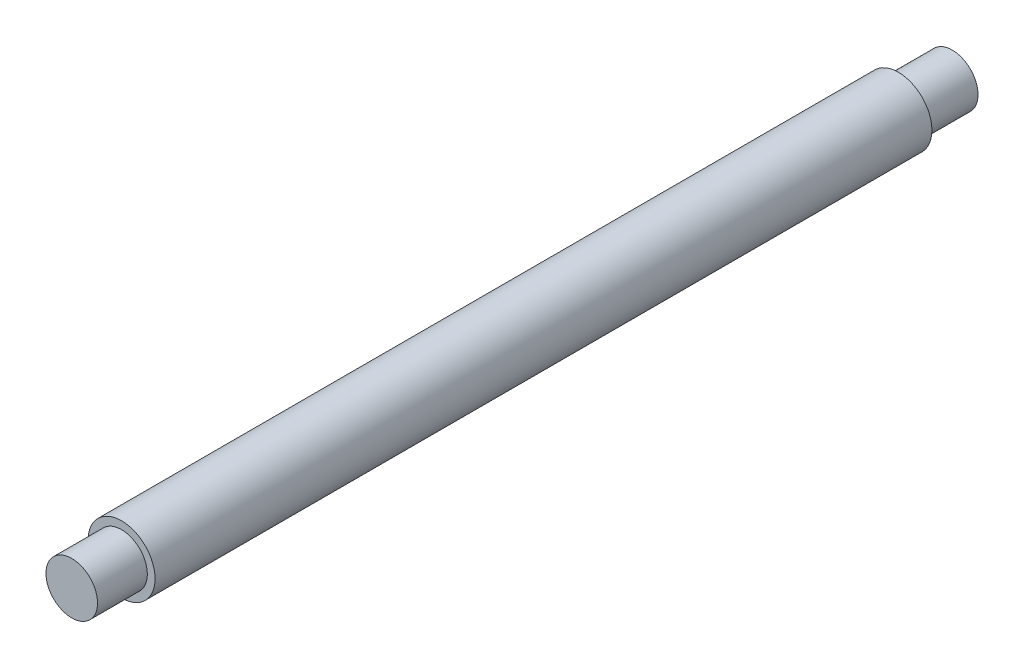
ISO-10303-21;
HEADER;
FILE_DESCRIPTION(('STEP AP214'),'2;1');
FILE_NAME('part.step','',(''),(''),'','','');
FILE_SCHEMA(('AUTOMOTIVE_DESIGN { 1 0 10303 214 1 1 1 1 }'));
ENDSEC;
DATA;
#1=APPLICATION_CONTEXT('core data for automotive mechanical design processes');
#2=APPLICATION_PROTOCOL_DEFINITION('international standard','automotive_design',2000,#1);
#3=PRODUCT_CONTEXT('',#1,'mechanical');
#4=PRODUCT('Part','Part','',(#3));
#5=PRODUCT_RELATED_PRODUCT_CATEGORY('part','',(#4));
#6=PRODUCT_DEFINITION_FORMATION('','',#4);
#7=PRODUCT_DEFINITION_CONTEXT('part definition',#1,'design');
#8=PRODUCT_DEFINITION('design','',#6,#7);
#9=PRODUCT_DEFINITION_SHAPE('','',#8);
#10=(LENGTH_UNIT() NAMED_UNIT(*) SI_UNIT(.MILLI.,.METRE.));
#11=(NAMED_UNIT(*) PLANE_ANGLE_UNIT() SI_UNIT($,.RADIAN.));
#12=(NAMED_UNIT(*) SI_UNIT($,.STERADIAN.) SOLID_ANGLE_UNIT());
#13=UNCERTAINTY_MEASURE_WITH_UNIT(LENGTH_MEASURE(1.E-05),#10,'distance_accuracy_value','');
#14=(GEOMETRIC_REPRESENTATION_CONTEXT(3) GLOBAL_UNCERTAINTY_ASSIGNED_CONTEXT((#13)) GLOBAL_UNIT_ASSIGNED_CONTEXT((#10,
#11,#12)) REPRESENTATION_CONTEXT('',''));
#15=CARTESIAN_POINT('',(0.,0.,0.));
#16=DIRECTION('',(0.,0.,1.));
#17=DIRECTION('',(1.,0.,0.));
#18=AXIS2_PLACEMENT_3D('',#15,#16,#17);
#19=CARTESIAN_POINT('',(0.,0.,3.72));
#20=DIRECTION('',(0.,0.,-1.));
#21=DIRECTION('',(-1.,0.,0.));
#22=AXIS2_PLACEMENT_3D('',#19,#20,#21);
#23=CYLINDRICAL_SURFACE('',#22,1.925);
#24=CARTESIAN_POINT('',(0.,0.,3.72));
#25=DIRECTION('',(0.,0.,1.));
#26=DIRECTION('',(1.,0.,0.));
#27=AXIS2_PLACEMENT_3D('',#24,#25,#26);
#28=CIRCLE('',#27,1.925);
#29=CARTESIAN_POINT('',(1.925,0.,3.72));
#30=VERTEX_POINT('',#29);
#31=EDGE_CURVE('E48',#30,#30,#28,.T.);
#32=ORIENTED_EDGE('',*,*,#31,.F.);
#33=EDGE_LOOP('',(#32));
#34=FACE_BOUND('',#33,.T.);
#35=CARTESIAN_POINT('',(0.,0.,0.));
#36=DIRECTION('',(0.,0.,1.));
#37=DIRECTION('',(1.,0.,0.));
#38=AXIS2_PLACEMENT_3D('',#35,#36,#37);
#39=CIRCLE('',#38,1.925);
#40=CARTESIAN_POINT('',(1.925,0.,0.));
#41=VERTEX_POINT('',#40);
#42=EDGE_CURVE('E44',#41,#41,#39,.T.);
#43=ORIENTED_EDGE('',*,*,#42,.T.);
#44=EDGE_LOOP('',(#43));
#45=FACE_BOUND('',#44,.T.);
#46=ADVANCED_FACE('F41',(#34,#45),#23,.T.);
#47=CARTESIAN_POINT('',(0.,0.,3.72));
#48=DIRECTION('',(0.,0.,1.));
#49=DIRECTION('',(1.,0.,0.));
#50=AXIS2_PLACEMENT_3D('',#47,#48,#49);
#51=PLANE('',#50);
#52=ORIENTED_EDGE('',*,*,#31,.T.);
#53=EDGE_LOOP('',(#52));
#54=FACE_BOUND('',#53,.T.);
#55=ADVANCED_FACE('F83',(#54),#51,.T.);
#56=CARTESIAN_POINT('',(0.,0.,-58.));
#57=DIRECTION('',(0.,0.,1.));
#58=DIRECTION('',(1.,0.,0.));
#59=AXIS2_PLACEMENT_3D('',#56,#57,#58);
#60=CYLINDRICAL_SURFACE('',#59,2.5);
#61=CARTESIAN_POINT('',(0.,0.,-58.));
#62=DIRECTION('',(0.,0.,-1.));
#63=DIRECTION('',(-1.,0.,0.));
#64=AXIS2_PLACEMENT_3D('',#61,#62,#63);
#65=CIRCLE('',#64,2.5);
#66=CARTESIAN_POINT('',(2.5,0.,-58.));
#67=VERTEX_POINT('',#66);
#68=EDGE_CURVE('E56',#67,#67,#65,.T.);
#69=CARTESIAN_POINT('',(0.,0.,0.));
#70=DIRECTION('',(0.,0.,-1.));
#71=DIRECTION('',(-1.,0.,0.));
#72=AXIS2_PLACEMENT_3D('',#69,#70,#71);
#73=CIRCLE('',#72,2.5);
#74=CARTESIAN_POINT('',(2.5,0.,0.));
#75=VERTEX_POINT('',#74);
#76=EDGE_CURVE('E59',#75,#75,#73,.T.);
#77=CARTESIAN_POINT('',(2.5,0.,-58.));
#78=CARTESIAN_POINT('',(2.5,0.,-57.3958333333333));
#79=CARTESIAN_POINT('',(2.5,0.,-56.7916666666667));
#80=CARTESIAN_POINT('',(2.5,0.,-55.5833333333333));
#81=CARTESIAN_POINT('',(2.5,0.,-54.9791666666667));
#82=CARTESIAN_POINT('',(2.5,0.,-53.7708333333333));
#83=CARTESIAN_POINT('',(2.5,0.,-53.1666666666667));
#84=CARTESIAN_POINT('',(2.5,0.,-51.9583333333333));
#85=CARTESIAN_POINT('',(2.5,0.,-51.3541666666667));
#86=CARTESIAN_POINT('',(2.5,0.,-50.1458333333333));
#87=CARTESIAN_POINT('',(2.5,0.,-49.5416666666667));
#88=CARTESIAN_POINT('',(2.5,0.,-48.3333333333333));
#89=CARTESIAN_POINT('',(2.5,0.,-47.7291666666667));
#90=CARTESIAN_POINT('',(2.5,0.,-46.5208333333333));
#91=CARTESIAN_POINT('',(2.5,0.,-45.9166666666667));
#92=CARTESIAN_POINT('',(2.5,0.,-44.7083333333333));
#93=CARTESIAN_POINT('',(2.5,0.,-44.1041666666667));
#94=CARTESIAN_POINT('',(2.5,0.,-42.8958333333333));
#95=CARTESIAN_POINT('',(2.5,0.,-42.2916666666667));
#96=CARTESIAN_POINT('',(2.5,0.,-41.0833333333333));
#97=CARTESIAN_POINT('',(2.5,0.,-40.4791666666667));
#98=CARTESIAN_POINT('',(2.5,0.,-39.2708333333333));
#99=CARTESIAN_POINT('',(2.5,0.,-38.6666666666667));
#100=CARTESIAN_POINT('',(2.5,0.,-37.4583333333333));
#101=CARTESIAN_POINT('',(2.5,0.,-36.8541666666667));
#102=CARTESIAN_POINT('',(2.5,0.,-35.6458333333333));
#103=CARTESIAN_POINT('',(2.5,0.,-35.0416666666667));
#104=CARTESIAN_POINT('',(2.5,0.,-33.8333333333333));
#105=CARTESIAN_POINT('',(2.5,0.,-33.2291666666667));
#106=CARTESIAN_POINT('',(2.5,0.,-32.0208333333333));
#107=CARTESIAN_POINT('',(2.5,0.,-31.4166666666667));
#108=CARTESIAN_POINT('',(2.5,0.,-30.2083333333333));
#109=CARTESIAN_POINT('',(2.5,0.,-29.6041666666667));
#110=CARTESIAN_POINT('',(2.5,0.,-28.3958333333333));
#111=CARTESIAN_POINT('',(2.5,0.,-27.7916666666667));
#112=CARTESIAN_POINT('',(2.5,0.,-26.5833333333333));
#113=CARTESIAN_POINT('',(2.5,0.,-25.9791666666667));
#114=CARTESIAN_POINT('',(2.5,0.,-24.7708333333333));
#115=CARTESIAN_POINT('',(2.5,0.,-24.1666666666667));
#116=CARTESIAN_POINT('',(2.5,0.,-22.9583333333333));
#117=CARTESIAN_POINT('',(2.5,0.,-22.3541666666667));
#118=CARTESIAN_POINT('',(2.5,0.,-21.1458333333333));
#119=CARTESIAN_POINT('',(2.5,0.,-20.5416666666667));
#120=CARTESIAN_POINT('',(2.5,0.,-19.3333333333333));
#121=CARTESIAN_POINT('',(2.5,0.,-18.7291666666667));
#122=CARTESIAN_POINT('',(2.5,0.,-17.5208333333333));
#123=CARTESIAN_POINT('',(2.5,0.,-16.9166666666667));
#124=CARTESIAN_POINT('',(2.5,0.,-15.7083333333333));
#125=CARTESIAN_POINT('',(2.5,0.,-15.1041666666667));
#126=CARTESIAN_POINT('',(2.5,0.,-13.8958333333333));
#127=CARTESIAN_POINT('',(2.5,0.,-13.2916666666667));
#128=CARTESIAN_POINT('',(2.5,0.,-12.0833333333333));
#129=CARTESIAN_POINT('',(2.5,0.,-11.4791666666667));
#130=CARTESIAN_POINT('',(2.5,0.,-10.2708333333333));
#131=CARTESIAN_POINT('',(2.5,0.,-9.66666666666667));
#132=CARTESIAN_POINT('',(2.5,0.,-8.45833333333333));
#133=CARTESIAN_POINT('',(2.5,0.,-7.85416666666667));
#134=CARTESIAN_POINT('',(2.5,0.,-6.64583333333333));
#135=CARTESIAN_POINT('',(2.5,0.,-6.04166666666667));
#136=CARTESIAN_POINT('',(2.5,0.,-4.83333333333333));
#137=CARTESIAN_POINT('',(2.5,0.,-4.22916666666667));
#138=CARTESIAN_POINT('',(2.5,0.,-3.02083333333334));
#139=CARTESIAN_POINT('',(2.5,0.,-2.41666666666667));
#140=CARTESIAN_POINT('',(2.5,0.,-1.20833333333333));
#141=CARTESIAN_POINT('',(2.5,0.,-0.604166666666666));
#142=CARTESIAN_POINT('',(2.5,0.,0.));
#143=B_SPLINE_CURVE_WITH_KNOTS('',3,(#77,#78,#79,#80,#81,#82,#83,#84,#85,#86,#87,#88,#89,#90,
#91,#92,#93,#94,#95,#96,#97,#98,#99,#100,#101,#102,#103,#104,#105,#106,#107,#108,#109,#110,#111,
#112,#113,#114,#115,#116,#117,#118,#119,#120,#121,#122,#123,#124,#125,#126,#127,#128,#129,#130,
#131,#132,#133,#134,#135,#136,#137,#138,#139,#140,#141,#142),.UNSPECIFIED.,.F.,.F.,(4,2,2,2,2,2,
2,2,2,2,2,2,2,2,2,2,2,2,2,2,2,2,2,2,2,2,2,2,2,2,2,2,4),(0.,1.81249999999999,3.625,5.4375,
7.24999999999999,9.06249999999999,10.875,12.6875,14.5,16.3125,18.125,19.9375,21.75,23.5625,
25.375,27.1875,29.,30.8125,32.625,34.4375,36.25,38.0625,39.875,41.6875,43.5,45.3125,47.125,
48.9375,50.75,52.5625,54.375,56.1875,58.),.UNSPECIFIED.);
#144=EDGE_CURVE('BSEAM88',#67,#75,#143,.T.);
#145=ORIENTED_EDGE('',*,*,#68,.F.);
#146=ORIENTED_EDGE('',*,*,#76,.T.);
#147=ORIENTED_EDGE('',*,*,#144,.T.);
#148=ORIENTED_EDGE('',*,*,#144,.F.);
#149=EDGE_LOOP('',(#145,#147,#146,#148));
#150=FACE_BOUND('',#149,.T.);
#151=ADVANCED_FACE('F88',(#150),#60,.T.);
#152=CARTESIAN_POINT('',(0.,0.,-58.));
#153=DIRECTION('',(0.,0.,-1.));
#154=DIRECTION('',(-1.,0.,0.));
#155=AXIS2_PLACEMENT_3D('',#152,#153,#154);
#156=PLANE('',#155);
#157=CARTESIAN_POINT('',(0.,0.,-58.));
#158=DIRECTION('',(0.,0.,-1.));
#159=DIRECTION('',(-1.,0.,0.));
#160=AXIS2_PLACEMENT_3D('',#157,#158,#159);
#161=CIRCLE('',#160,1.925);
#162=CARTESIAN_POINT('',(-1.925,0.,-58.));
#163=VERTEX_POINT('',#162);
#164=EDGE_CURVE('E10',#163,#163,#161,.T.);
#165=ORIENTED_EDGE('',*,*,#164,.F.);
#166=EDGE_LOOP('',(#165));
#167=FACE_BOUND('',#166,.T.);
#168=ORIENTED_EDGE('',*,*,#68,.T.);
#169=EDGE_LOOP('',(#168));
#170=FACE_BOUND('',#169,.T.);
#171=ADVANCED_FACE('F78',(#167,#170),#156,.T.);
#172=CARTESIAN_POINT('',(0.,0.,0.));
#173=DIRECTION('',(0.,0.,-1.));
#174=DIRECTION('',(-1.,0.,0.));
#175=AXIS2_PLACEMENT_3D('',#172,#173,#174);
#176=PLANE('',#175);
#177=ORIENTED_EDGE('',*,*,#42,.F.);
#178=EDGE_LOOP('',(#177));
#179=FACE_BOUND('',#178,.T.);
#180=ORIENTED_EDGE('',*,*,#76,.F.);
#181=EDGE_LOOP('',(#180));
#182=FACE_BOUND('',#181,.T.);
#183=ADVANCED_FACE('F70',(#179,#182),#176,.F.);
#184=CARTESIAN_POINT('',(0.,0.,-62.02));
#185=DIRECTION('',(0.,0.,1.));
#186=DIRECTION('',(1.,0.,0.));
#187=AXIS2_PLACEMENT_3D('',#184,#185,#186);
#188=CYLINDRICAL_SURFACE('',#187,1.925);
#189=CARTESIAN_POINT('',(0.,0.,-62.02));
#190=DIRECTION('',(0.,0.,-1.));
#191=DIRECTION('',(-1.,0.,0.));
#192=AXIS2_PLACEMENT_3D('',#189,#190,#191);
#193=CIRCLE('',#192,1.925);
#194=CARTESIAN_POINT('',(-1.925,0.,-62.02));
#195=VERTEX_POINT('',#194);
#196=EDGE_CURVE('E55',#195,#195,#193,.T.);
#197=ORIENTED_EDGE('',*,*,#196,.F.);
#198=EDGE_LOOP('',(#197));
#199=FACE_BOUND('',#198,.T.);
#200=ORIENTED_EDGE('',*,*,#164,.T.);
#201=EDGE_LOOP('',(#200));
#202=FACE_BOUND('',#201,.T.);
#203=ADVANCED_FACE('F68',(#199,#202),#188,.T.);
#204=CARTESIAN_POINT('',(0.,0.,-62.02));
#205=DIRECTION('',(0.,0.,-1.));
#206=DIRECTION('',(-1.,0.,0.));
#207=AXIS2_PLACEMENT_3D('',#204,#205,#206);
#208=PLANE('',#207);
#209=ORIENTED_EDGE('',*,*,#196,.T.);
#210=EDGE_LOOP('',(#209));
#211=FACE_BOUND('',#210,.T.);
#212=ADVANCED_FACE('F66',(#211),#208,.T.);
#213=CLOSED_SHELL('',(#46,#55,#151,#171,#183,#203,#212));
#214=MANIFOLD_SOLID_BREP('B2',#213);
#215=ADVANCED_BREP_SHAPE_REPRESENTATION('',(#18,#214),#14);
#216=SHAPE_DEFINITION_REPRESENTATION(#9,#215);
ENDSEC;
END-ISO-10303-21;
